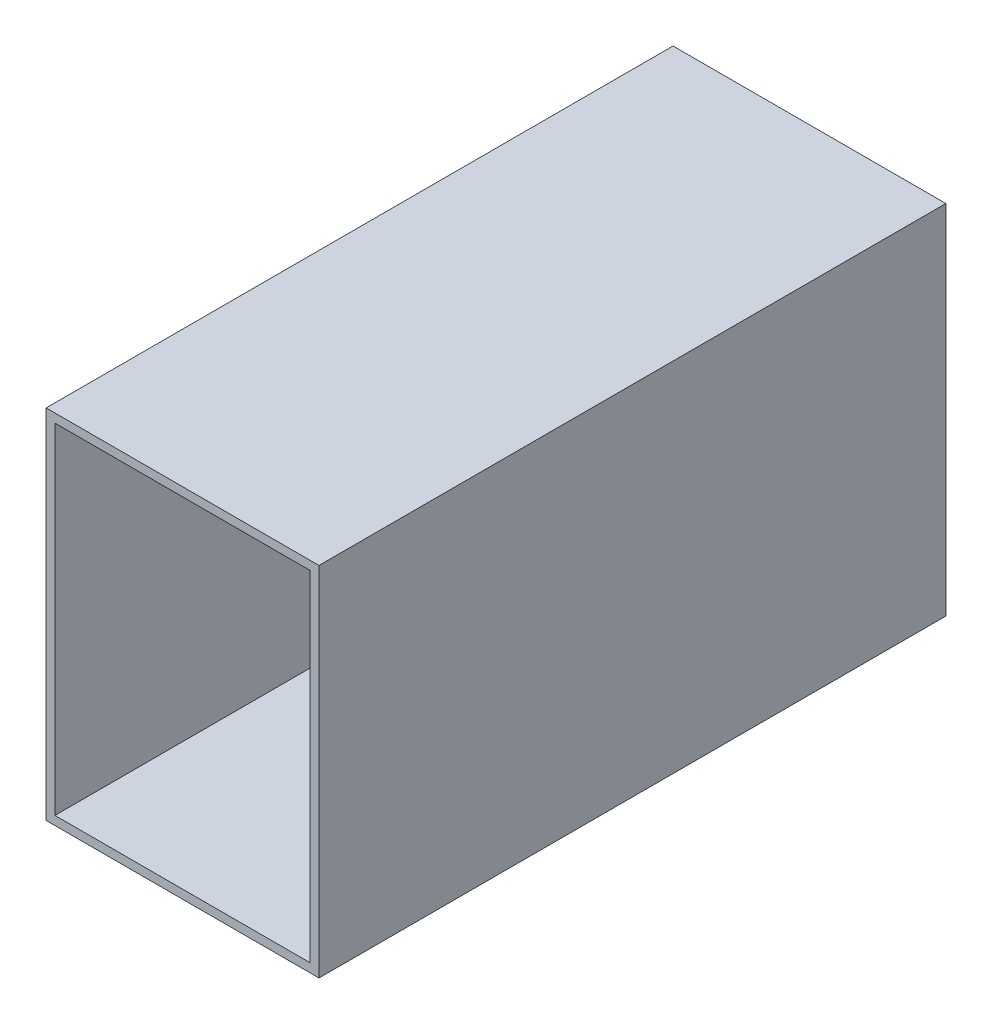
ISO-10303-21;
HEADER;
FILE_DESCRIPTION(('STEP AP214'),'2;1');
FILE_NAME('part.step','',(''),(''),'','','');
FILE_SCHEMA(('AUTOMOTIVE_DESIGN { 1 0 10303 214 1 1 1 1 }'));
ENDSEC;
DATA;
#1=APPLICATION_CONTEXT('core data for automotive mechanical design processes');
#2=APPLICATION_PROTOCOL_DEFINITION('international standard','automotive_design',2000,#1);
#3=PRODUCT_CONTEXT('',#1,'mechanical');
#4=PRODUCT('Part','Part','',(#3));
#5=PRODUCT_RELATED_PRODUCT_CATEGORY('part','',(#4));
#6=PRODUCT_DEFINITION_FORMATION('','',#4);
#7=PRODUCT_DEFINITION_CONTEXT('part definition',#1,'design');
#8=PRODUCT_DEFINITION('design','',#6,#7);
#9=PRODUCT_DEFINITION_SHAPE('','',#8);
#10=(LENGTH_UNIT() NAMED_UNIT(*) SI_UNIT(.MILLI.,.METRE.));
#11=(NAMED_UNIT(*) PLANE_ANGLE_UNIT() SI_UNIT($,.RADIAN.));
#12=(NAMED_UNIT(*) SI_UNIT($,.STERADIAN.) SOLID_ANGLE_UNIT());
#13=UNCERTAINTY_MEASURE_WITH_UNIT(LENGTH_MEASURE(1.E-05),#10,'distance_accuracy_value','');
#14=(GEOMETRIC_REPRESENTATION_CONTEXT(3) GLOBAL_UNCERTAINTY_ASSIGNED_CONTEXT((#13)) GLOBAL_UNIT_ASSIGNED_CONTEXT((#10,
#11,#12)) REPRESENTATION_CONTEXT('',''));
#15=CARTESIAN_POINT('',(0.,0.,0.));
#16=DIRECTION('',(0.,0.,1.));
#17=DIRECTION('',(1.,0.,0.));
#18=AXIS2_PLACEMENT_3D('',#15,#16,#17);
#19=CARTESIAN_POINT('',(813.,1073.,1930.));
#20=DIRECTION('',(0.,-1.,0.));
#21=DIRECTION('',(0.,0.,-1.));
#22=AXIS2_PLACEMENT_3D('',#19,#20,#21);
#23=PLANE('',#22);
#24=DIRECTION('',(1.,0.,0.));
#25=VECTOR('',#24,1.);
#26=CARTESIAN_POINT('',(813.,1073.,430.));
#27=LINE('',#26,#25);
#28=CARTESIAN_POINT('',(27.,1073.,430.));
#29=VERTEX_POINT('',#28);
#30=CARTESIAN_POINT('',(813.,1073.,430.));
#31=VERTEX_POINT('',#30);
#32=EDGE_CURVE('E151',#29,#31,#27,.T.);
#33=ORIENTED_EDGE('',*,*,#32,.F.);
#34=DIRECTION('',(0.,0.,-1.));
#35=VECTOR('',#34,1.);
#36=CARTESIAN_POINT('',(27.,1073.,1930.));
#37=LINE('',#36,#35);
#38=CARTESIAN_POINT('',(27.,1073.,30.));
#39=VERTEX_POINT('',#38);
#40=EDGE_CURVE('E181',#29,#39,#37,.T.);
#41=ORIENTED_EDGE('',*,*,#40,.T.);
#42=DIRECTION('',(-1.,0.,0.));
#43=VECTOR('',#42,1.);
#44=CARTESIAN_POINT('',(813.,1073.,30.));
#45=LINE('',#44,#43);
#46=CARTESIAN_POINT('',(813.,1073.,30.));
#47=VERTEX_POINT('',#46);
#48=EDGE_CURVE('E154',#47,#39,#45,.T.);
#49=ORIENTED_EDGE('',*,*,#48,.F.);
#50=DIRECTION('',(0.,0.,-1.));
#51=VECTOR('',#50,1.);
#52=CARTESIAN_POINT('',(813.,1073.,1930.));
#53=LINE('',#52,#51);
#54=EDGE_CURVE('E165',#31,#47,#53,.T.);
#55=ORIENTED_EDGE('',*,*,#54,.F.);
#56=EDGE_LOOP('',(#33,#41,#49,#55));
#57=FACE_BOUND('',#56,.T.);
#58=ADVANCED_FACE('F32',(#57),#23,.T.);
#59=CARTESIAN_POINT('',(0.,0.,30.));
#60=DIRECTION('',(1.,0.,0.));
#61=DIRECTION('',(0.,0.,-1.));
#62=AXIS2_PLACEMENT_3D('',#59,#60,#61);
#63=PLANE('',#62);
#64=DIRECTION('',(0.,-1.,0.));
#65=VECTOR('',#64,1.);
#66=CARTESIAN_POINT('',(0.,0.,0.));
#67=LINE('',#66,#65);
#68=CARTESIAN_POINT('',(0.,1100.,0.));
#69=VERTEX_POINT('',#68);
#70=CARTESIAN_POINT('',(0.,0.,0.));
#71=VERTEX_POINT('',#70);
#72=EDGE_CURVE('E197',#69,#71,#67,.T.);
#73=ORIENTED_EDGE('',*,*,#72,.T.);
#74=DIRECTION('',(0.,0.,-1.));
#75=VECTOR('',#74,1.);
#76=CARTESIAN_POINT('',(0.,0.,30.));
#77=LINE('',#76,#75);
#78=CARTESIAN_POINT('',(0.,0.,1930.));
#79=VERTEX_POINT('',#78);
#80=EDGE_CURVE('E11',#79,#71,#77,.T.);
#81=ORIENTED_EDGE('',*,*,#80,.F.);
#82=DIRECTION('',(0.,-1.,0.));
#83=VECTOR('',#82,1.);
#84=CARTESIAN_POINT('',(0.,1100.,1930.));
#85=LINE('',#84,#83);
#86=CARTESIAN_POINT('',(0.,1100.,1930.));
#87=VERTEX_POINT('',#86);
#88=EDGE_CURVE('E188',#87,#79,#85,.T.);
#89=ORIENTED_EDGE('',*,*,#88,.F.);
#90=DIRECTION('',(0.,0.,-1.));
#91=VECTOR('',#90,1.);
#92=CARTESIAN_POINT('',(0.,1100.,30.));
#93=LINE('',#92,#91);
#94=EDGE_CURVE('E206',#87,#69,#93,.T.);
#95=ORIENTED_EDGE('',*,*,#94,.T.);
#96=EDGE_LOOP('',(#73,#81,#89,#95));
#97=FACE_BOUND('',#96,.T.);
#98=ADVANCED_FACE('F34',(#97),#63,.F.);
#99=CARTESIAN_POINT('',(0.,0.,30.));
#100=DIRECTION('',(0.,1.,0.));
#101=DIRECTION('',(0.,0.,1.));
#102=AXIS2_PLACEMENT_3D('',#99,#100,#101);
#103=PLANE('',#102);
#104=DIRECTION('',(1.,0.,0.));
#105=VECTOR('',#104,1.);
#106=CARTESIAN_POINT('',(0.,0.,0.));
#107=LINE('',#106,#105);
#108=CARTESIAN_POINT('',(840.,0.,0.));
#109=VERTEX_POINT('',#108);
#110=EDGE_CURVE('E200',#71,#109,#107,.T.);
#111=ORIENTED_EDGE('',*,*,#110,.T.);
#112=DIRECTION('',(0.,0.,-1.));
#113=VECTOR('',#112,1.);
#114=CARTESIAN_POINT('',(840.,0.,30.));
#115=LINE('',#114,#113);
#116=CARTESIAN_POINT('',(840.,0.,1930.));
#117=VERTEX_POINT('',#116);
#118=EDGE_CURVE('E40',#117,#109,#115,.T.);
#119=ORIENTED_EDGE('',*,*,#118,.F.);
#120=DIRECTION('',(1.,0.,0.));
#121=VECTOR('',#120,1.);
#122=CARTESIAN_POINT('',(0.,0.,1930.));
#123=LINE('',#122,#121);
#124=EDGE_CURVE('E191',#79,#117,#123,.T.);
#125=ORIENTED_EDGE('',*,*,#124,.F.);
#126=ORIENTED_EDGE('',*,*,#80,.T.);
#127=EDGE_LOOP('',(#111,#119,#125,#126));
#128=FACE_BOUND('',#127,.T.);
#129=ADVANCED_FACE('F230',(#128),#103,.F.);
#130=CARTESIAN_POINT('',(840.,0.,30.));
#131=DIRECTION('',(-1.,0.,0.));
#132=DIRECTION('',(0.,0.,1.));
#133=AXIS2_PLACEMENT_3D('',#130,#131,#132);
#134=PLANE('',#133);
#135=DIRECTION('',(0.,1.,0.));
#136=VECTOR('',#135,1.);
#137=CARTESIAN_POINT('',(840.,0.,0.));
#138=LINE('',#137,#136);
#139=CARTESIAN_POINT('',(840.,1100.,0.));
#140=VERTEX_POINT('',#139);
#141=EDGE_CURVE('E202',#109,#140,#138,.T.);
#142=ORIENTED_EDGE('',*,*,#141,.T.);
#143=DIRECTION('',(0.,0.,-1.));
#144=VECTOR('',#143,1.);
#145=CARTESIAN_POINT('',(840.,1100.,30.));
#146=LINE('',#145,#144);
#147=CARTESIAN_POINT('',(840.,1100.,1930.));
#148=VERTEX_POINT('',#147);
#149=EDGE_CURVE('E209',#148,#140,#146,.T.);
#150=ORIENTED_EDGE('',*,*,#149,.F.);
#151=DIRECTION('',(0.,1.,0.));
#152=VECTOR('',#151,1.);
#153=CARTESIAN_POINT('',(840.,0.,1930.));
#154=LINE('',#153,#152);
#155=EDGE_CURVE('E194',#117,#148,#154,.T.);
#156=ORIENTED_EDGE('',*,*,#155,.F.);
#157=ORIENTED_EDGE('',*,*,#118,.T.);
#158=EDGE_LOOP('',(#142,#150,#156,#157));
#159=FACE_BOUND('',#158,.T.);
#160=ADVANCED_FACE('F215',(#159),#134,.F.);
#161=CARTESIAN_POINT('',(0.,1100.,30.));
#162=DIRECTION('',(0.,-1.,0.));
#163=DIRECTION('',(0.,0.,-1.));
#164=AXIS2_PLACEMENT_3D('',#161,#162,#163);
#165=PLANE('',#164);
#166=DIRECTION('',(-1.,0.,0.));
#167=VECTOR('',#166,1.);
#168=CARTESIAN_POINT('',(0.,1100.,0.));
#169=LINE('',#168,#167);
#170=EDGE_CURVE('E204',#140,#69,#169,.T.);
#171=ORIENTED_EDGE('',*,*,#170,.T.);
#172=ORIENTED_EDGE('',*,*,#94,.F.);
#173=DIRECTION('',(-1.,0.,0.));
#174=VECTOR('',#173,1.);
#175=CARTESIAN_POINT('',(840.,1100.,1930.));
#176=LINE('',#175,#174);
#177=EDGE_CURVE('E185',#148,#87,#176,.T.);
#178=ORIENTED_EDGE('',*,*,#177,.F.);
#179=ORIENTED_EDGE('',*,*,#149,.T.);
#180=EDGE_LOOP('',(#171,#172,#178,#179));
#181=FACE_BOUND('',#180,.T.);
#182=ADVANCED_FACE('F223',(#181),#165,.F.);
#183=CARTESIAN_POINT('',(0.,0.,0.));
#184=DIRECTION('',(0.,0.,-1.));
#185=DIRECTION('',(-1.,0.,0.));
#186=AXIS2_PLACEMENT_3D('',#183,#184,#185);
#187=PLANE('',#186);
#188=ORIENTED_EDGE('',*,*,#72,.F.);
#189=ORIENTED_EDGE('',*,*,#170,.F.);
#190=ORIENTED_EDGE('',*,*,#141,.F.);
#191=ORIENTED_EDGE('',*,*,#110,.F.);
#192=EDGE_LOOP('',(#188,#189,#190,#191));
#193=FACE_BOUND('',#192,.T.);
#194=ADVANCED_FACE('F221',(#193),#187,.T.);
#195=CARTESIAN_POINT('',(0.,0.,1930.));
#196=DIRECTION('',(0.,0.,1.));
#197=DIRECTION('',(1.,0.,0.));
#198=AXIS2_PLACEMENT_3D('',#195,#196,#197);
#199=PLANE('',#198);
#200=ORIENTED_EDGE('',*,*,#177,.T.);
#201=ORIENTED_EDGE('',*,*,#88,.T.);
#202=ORIENTED_EDGE('',*,*,#124,.T.);
#203=ORIENTED_EDGE('',*,*,#155,.T.);
#204=EDGE_LOOP('',(#200,#201,#202,#203));
#205=FACE_BOUND('',#204,.T.);
#206=DIRECTION('',(0.,-1.,0.));
#207=VECTOR('',#206,1.);
#208=CARTESIAN_POINT('',(27.,1073.,1930.));
#209=LINE('',#208,#207);
#210=CARTESIAN_POINT('',(27.,1073.,1930.));
#211=VERTEX_POINT('',#210);
#212=CARTESIAN_POINT('',(27.,27.,1930.));
#213=VERTEX_POINT('',#212);
#214=EDGE_CURVE('E157',#211,#213,#209,.T.);
#215=ORIENTED_EDGE('',*,*,#214,.F.);
#216=DIRECTION('',(-1.,0.,0.));
#217=VECTOR('',#216,1.);
#218=CARTESIAN_POINT('',(813.,1073.,1930.));
#219=LINE('',#218,#217);
#220=CARTESIAN_POINT('',(813.,1073.,1930.));
#221=VERTEX_POINT('',#220);
#222=EDGE_CURVE('E155',#221,#211,#219,.T.);
#223=ORIENTED_EDGE('',*,*,#222,.F.);
#224=DIRECTION('',(0.,1.,0.));
#225=VECTOR('',#224,1.);
#226=CARTESIAN_POINT('',(813.,27.,1930.));
#227=LINE('',#226,#225);
#228=CARTESIAN_POINT('',(813.,27.,1930.));
#229=VERTEX_POINT('',#228);
#230=EDGE_CURVE('E163',#229,#221,#227,.T.);
#231=ORIENTED_EDGE('',*,*,#230,.F.);
#232=DIRECTION('',(1.,0.,0.));
#233=VECTOR('',#232,1.);
#234=CARTESIAN_POINT('',(27.,27.,1930.));
#235=LINE('',#234,#233);
#236=EDGE_CURVE('E160',#213,#229,#235,.T.);
#237=ORIENTED_EDGE('',*,*,#236,.F.);
#238=EDGE_LOOP('',(#215,#223,#231,#237));
#239=FACE_BOUND('',#238,.T.);
#240=ADVANCED_FACE('F228',(#205,#239),#199,.T.);
#241=DIRECTION('',(-1.,0.,0.));
#242=VECTOR('',#241,1.);
#243=CARTESIAN_POINT('',(813.,1073.,457.));
#244=LINE('',#243,#242);
#245=CARTESIAN_POINT('',(813.,1073.,457.000000000001));
#246=VERTEX_POINT('',#245);
#247=CARTESIAN_POINT('',(27.,1073.,457.000000000001));
#248=VERTEX_POINT('',#247);
#249=EDGE_CURVE('E147',#246,#248,#244,.T.);
#250=ORIENTED_EDGE('',*,*,#249,.F.);
#251=EDGE_CURVE('E126',#221,#246,#53,.T.);
#252=ORIENTED_EDGE('',*,*,#251,.F.);
#253=ORIENTED_EDGE('',*,*,#222,.T.);
#254=EDGE_CURVE('E182',#211,#248,#37,.T.);
#255=ORIENTED_EDGE('',*,*,#254,.T.);
#256=EDGE_LOOP('',(#250,#252,#253,#255));
#257=FACE_BOUND('',#256,.T.);
#258=ADVANCED_FACE('F240',(#257),#23,.T.);
#259=CARTESIAN_POINT('',(27.,1073.,1930.));
#260=DIRECTION('',(1.,0.,0.));
#261=DIRECTION('',(0.,0.,-1.));
#262=AXIS2_PLACEMENT_3D('',#259,#260,#261);
#263=PLANE('',#262);
#264=DIRECTION('',(0.,1.,0.));
#265=VECTOR('',#264,1.);
#266=CARTESIAN_POINT('',(27.,560.,430.));
#267=LINE('',#266,#265);
#268=CARTESIAN_POINT('',(27.,560.,430.));
#269=VERTEX_POINT('',#268);
#270=EDGE_CURVE('E47',#269,#29,#267,.T.);
#271=ORIENTED_EDGE('',*,*,#270,.F.);
#272=DIRECTION('',(0.,0.,1.));
#273=VECTOR('',#272,1.);
#274=CARTESIAN_POINT('',(27.,560.,457.));
#275=LINE('',#274,#273);
#276=CARTESIAN_POINT('',(27.,560.,457.));
#277=VERTEX_POINT('',#276);
#278=EDGE_CURVE('E51',#269,#277,#275,.T.);
#279=ORIENTED_EDGE('',*,*,#278,.T.);
#280=DIRECTION('',(0.,1.,0.));
#281=VECTOR('',#280,1.);
#282=CARTESIAN_POINT('',(27.,560.,457.));
#283=LINE('',#282,#281);
#284=EDGE_CURVE('E131',#277,#248,#283,.T.);
#285=ORIENTED_EDGE('',*,*,#284,.T.);
#286=ORIENTED_EDGE('',*,*,#254,.F.);
#287=ORIENTED_EDGE('',*,*,#214,.T.);
#288=DIRECTION('',(0.,0.,-1.));
#289=VECTOR('',#288,1.);
#290=CARTESIAN_POINT('',(27.,27.,1930.));
#291=LINE('',#290,#289);
#292=CARTESIAN_POINT('',(27.,27.,30.));
#293=VERTEX_POINT('',#292);
#294=EDGE_CURVE('E179',#213,#293,#291,.T.);
#295=ORIENTED_EDGE('',*,*,#294,.T.);
#296=DIRECTION('',(0.,-1.,0.));
#297=VECTOR('',#296,1.);
#298=CARTESIAN_POINT('',(27.,1073.,30.));
#299=LINE('',#298,#297);
#300=EDGE_CURVE('E168',#39,#293,#299,.T.);
#301=ORIENTED_EDGE('',*,*,#300,.F.);
#302=ORIENTED_EDGE('',*,*,#40,.F.);
#303=EDGE_LOOP('',(#271,#279,#285,#286,#287,#295,#301,#302));
#304=FACE_BOUND('',#303,.T.);
#305=ADVANCED_FACE('F246',(#304),#263,.T.);
#306=CARTESIAN_POINT('',(27.,27.,1930.));
#307=DIRECTION('',(0.,1.,0.));
#308=DIRECTION('',(0.,0.,1.));
#309=AXIS2_PLACEMENT_3D('',#306,#307,#308);
#310=PLANE('',#309);
#311=DIRECTION('',(1.,0.,0.));
#312=VECTOR('',#311,1.);
#313=CARTESIAN_POINT('',(27.,27.,30.));
#314=LINE('',#313,#312);
#315=CARTESIAN_POINT('',(813.,27.,30.));
#316=VERTEX_POINT('',#315);
#317=EDGE_CURVE('E171',#293,#316,#314,.T.);
#318=ORIENTED_EDGE('',*,*,#317,.F.);
#319=ORIENTED_EDGE('',*,*,#294,.F.);
#320=ORIENTED_EDGE('',*,*,#236,.T.);
#321=DIRECTION('',(0.,0.,-1.));
#322=VECTOR('',#321,1.);
#323=CARTESIAN_POINT('',(813.,27.,1930.));
#324=LINE('',#323,#322);
#325=EDGE_CURVE('E177',#229,#316,#324,.T.);
#326=ORIENTED_EDGE('',*,*,#325,.T.);
#327=EDGE_LOOP('',(#318,#319,#320,#326));
#328=FACE_BOUND('',#327,.T.);
#329=ADVANCED_FACE('F252',(#328),#310,.T.);
#330=CARTESIAN_POINT('',(813.,27.,1930.));
#331=DIRECTION('',(-1.,0.,0.));
#332=DIRECTION('',(0.,0.,1.));
#333=AXIS2_PLACEMENT_3D('',#330,#331,#332);
#334=PLANE('',#333);
#335=DIRECTION('',(0.,1.,0.));
#336=VECTOR('',#335,1.);
#337=CARTESIAN_POINT('',(813.,560.,430.));
#338=LINE('',#337,#336);
#339=CARTESIAN_POINT('',(813.,560.,430.));
#340=VERTEX_POINT('',#339);
#341=EDGE_CURVE('E130',#340,#31,#338,.T.);
#342=ORIENTED_EDGE('',*,*,#341,.T.);
#343=ORIENTED_EDGE('',*,*,#54,.T.);
#344=DIRECTION('',(0.,1.,0.));
#345=VECTOR('',#344,1.);
#346=CARTESIAN_POINT('',(813.,27.,30.));
#347=LINE('',#346,#345);
#348=EDGE_CURVE('E158',#316,#47,#347,.T.);
#349=ORIENTED_EDGE('',*,*,#348,.F.);
#350=ORIENTED_EDGE('',*,*,#325,.F.);
#351=ORIENTED_EDGE('',*,*,#230,.T.);
#352=ORIENTED_EDGE('',*,*,#251,.T.);
#353=DIRECTION('',(0.,1.,0.));
#354=VECTOR('',#353,1.);
#355=CARTESIAN_POINT('',(813.,560.,457.));
#356=LINE('',#355,#354);
#357=CARTESIAN_POINT('',(813.,560.,457.));
#358=VERTEX_POINT('',#357);
#359=EDGE_CURVE('E120',#358,#246,#356,.T.);
#360=ORIENTED_EDGE('',*,*,#359,.F.);
#361=DIRECTION('',(0.,0.,-1.));
#362=VECTOR('',#361,1.);
#363=CARTESIAN_POINT('',(813.,560.,457.));
#364=LINE('',#363,#362);
#365=EDGE_CURVE('E123',#358,#340,#364,.T.);
#366=ORIENTED_EDGE('',*,*,#365,.T.);
#367=EDGE_LOOP('',(#342,#343,#349,#350,#351,#352,#360,#366));
#368=FACE_BOUND('',#367,.T.);
#369=ADVANCED_FACE('F122',(#368),#334,.T.);
#370=CARTESIAN_POINT('',(0.,0.,30.));
#371=DIRECTION('',(0.,0.,-1.));
#372=DIRECTION('',(-1.,0.,0.));
#373=AXIS2_PLACEMENT_3D('',#370,#371,#372);
#374=PLANE('',#373);
#375=ORIENTED_EDGE('',*,*,#348,.T.);
#376=ORIENTED_EDGE('',*,*,#48,.T.);
#377=ORIENTED_EDGE('',*,*,#300,.T.);
#378=ORIENTED_EDGE('',*,*,#317,.T.);
#379=EDGE_LOOP('',(#375,#376,#377,#378));
#380=FACE_BOUND('',#379,.T.);
#381=ADVANCED_FACE('F265',(#380),#374,.F.);
#382=CARTESIAN_POINT('',(27.,560.,430.));
#383=DIRECTION('',(0.,0.,-1.));
#384=DIRECTION('',(-1.,0.,0.));
#385=AXIS2_PLACEMENT_3D('',#382,#383,#384);
#386=PLANE('',#385);
#387=ORIENTED_EDGE('',*,*,#270,.T.);
#388=ORIENTED_EDGE('',*,*,#32,.T.);
#389=ORIENTED_EDGE('',*,*,#341,.F.);
#390=DIRECTION('',(-1.,0.,0.));
#391=VECTOR('',#390,1.);
#392=CARTESIAN_POINT('',(27.,560.,430.));
#393=LINE('',#392,#391);
#394=EDGE_CURVE('E139',#340,#269,#393,.T.);
#395=ORIENTED_EDGE('',*,*,#394,.T.);
#396=EDGE_LOOP('',(#387,#388,#389,#395));
#397=FACE_BOUND('',#396,.T.);
#398=ADVANCED_FACE('F268',(#397),#386,.T.);
#399=CARTESIAN_POINT('',(27.,560.,457.));
#400=DIRECTION('',(0.,0.,1.));
#401=DIRECTION('',(1.,0.,0.));
#402=AXIS2_PLACEMENT_3D('',#399,#400,#401);
#403=PLANE('',#402);
#404=ORIENTED_EDGE('',*,*,#359,.T.);
#405=ORIENTED_EDGE('',*,*,#249,.T.);
#406=ORIENTED_EDGE('',*,*,#284,.F.);
#407=DIRECTION('',(1.,0.,0.));
#408=VECTOR('',#407,1.);
#409=CARTESIAN_POINT('',(27.,560.,457.));
#410=LINE('',#409,#408);
#411=EDGE_CURVE('E137',#277,#358,#410,.T.);
#412=ORIENTED_EDGE('',*,*,#411,.T.);
#413=EDGE_LOOP('',(#404,#405,#406,#412));
#414=FACE_BOUND('',#413,.T.);
#415=ADVANCED_FACE('F141',(#414),#403,.T.);
#416=CARTESIAN_POINT('',(0.,560.,0.));
#417=DIRECTION('',(0.,-1.,0.));
#418=DIRECTION('',(0.,0.,-1.));
#419=AXIS2_PLACEMENT_3D('',#416,#417,#418);
#420=PLANE('',#419);
#421=ORIENTED_EDGE('',*,*,#278,.F.);
#422=ORIENTED_EDGE('',*,*,#394,.F.);
#423=ORIENTED_EDGE('',*,*,#365,.F.);
#424=ORIENTED_EDGE('',*,*,#411,.F.);
#425=EDGE_LOOP('',(#421,#422,#423,#424));
#426=FACE_BOUND('',#425,.T.);
#427=ADVANCED_FACE('F136',(#426),#420,.T.);
#428=CLOSED_SHELL('',(#58,#98,#129,#160,#182,#194,#240,#258,#305,#329,#369,#381,#398,#415,#427));
#429=MANIFOLD_SOLID_BREP('B2',#428);
#430=ADVANCED_BREP_SHAPE_REPRESENTATION('',(#18,#429),#14);
#431=SHAPE_DEFINITION_REPRESENTATION(#9,#430);
ENDSEC;
END-ISO-10303-21;
